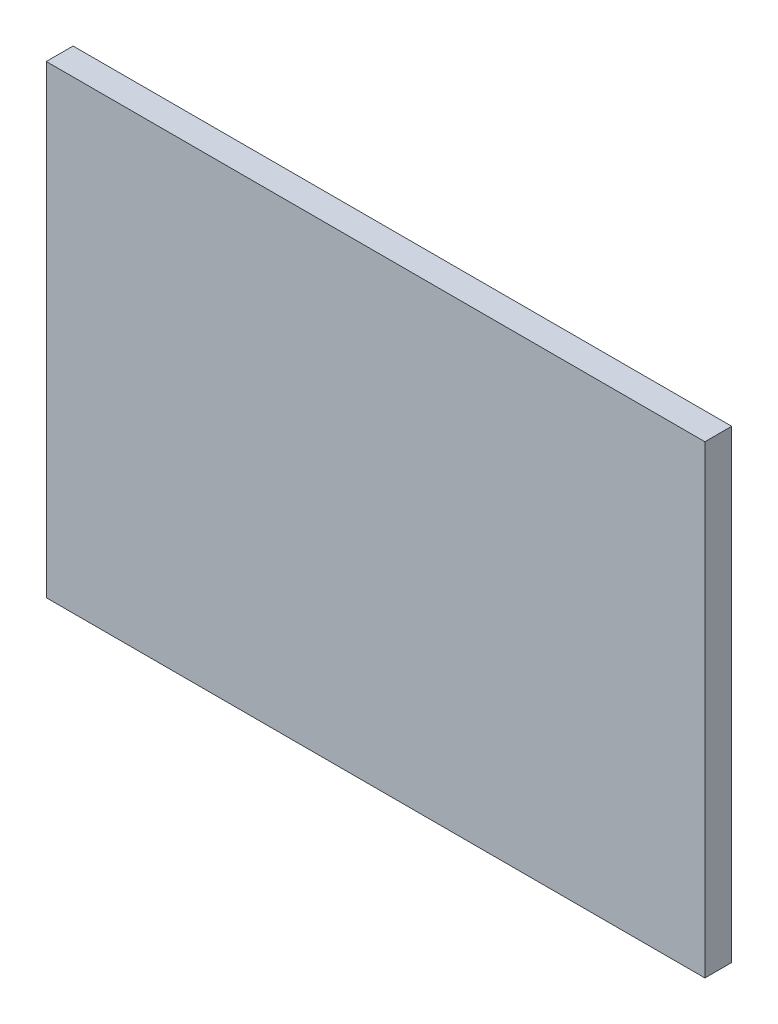
ISO-10303-21;
HEADER;
FILE_DESCRIPTION(('STEP AP214'),'2;1');
FILE_NAME('part.step','',(''),(''),'','','');
FILE_SCHEMA(('AUTOMOTIVE_DESIGN { 1 0 10303 214 1 1 1 1 }'));
ENDSEC;
DATA;
#1=APPLICATION_CONTEXT('core data for automotive mechanical design processes');
#2=APPLICATION_PROTOCOL_DEFINITION('international standard','automotive_design',2000,#1);
#3=PRODUCT_CONTEXT('',#1,'mechanical');
#4=PRODUCT('Part','Part','',(#3));
#5=PRODUCT_RELATED_PRODUCT_CATEGORY('part','',(#4));
#6=PRODUCT_DEFINITION_FORMATION('','',#4);
#7=PRODUCT_DEFINITION_CONTEXT('part definition',#1,'design');
#8=PRODUCT_DEFINITION('design','',#6,#7);
#9=PRODUCT_DEFINITION_SHAPE('','',#8);
#10=(LENGTH_UNIT() NAMED_UNIT(*) SI_UNIT(.MILLI.,.METRE.));
#11=(NAMED_UNIT(*) PLANE_ANGLE_UNIT() SI_UNIT($,.RADIAN.));
#12=(NAMED_UNIT(*) SI_UNIT($,.STERADIAN.) SOLID_ANGLE_UNIT());
#13=UNCERTAINTY_MEASURE_WITH_UNIT(LENGTH_MEASURE(1.E-05),#10,'distance_accuracy_value','');
#14=(GEOMETRIC_REPRESENTATION_CONTEXT(3) GLOBAL_UNCERTAINTY_ASSIGNED_CONTEXT((#13)) GLOBAL_UNIT_ASSIGNED_CONTEXT((#10,
#11,#12)) REPRESENTATION_CONTEXT('',''));
#15=CARTESIAN_POINT('',(0.,0.,0.));
#16=DIRECTION('',(0.,0.,1.));
#17=DIRECTION('',(1.,0.,0.));
#18=AXIS2_PLACEMENT_3D('',#15,#16,#17);
#19=CARTESIAN_POINT('',(19.5,-13.75,1.5875));
#20=DIRECTION('',(-1.,0.,0.));
#21=DIRECTION('',(0.,0.,1.));
#22=AXIS2_PLACEMENT_3D('',#19,#20,#21);
#23=PLANE('',#22);
#24=DIRECTION('',(0.,1.,0.));
#25=VECTOR('',#24,1.);
#26=CARTESIAN_POINT('',(19.5,-13.75,0.));
#27=LINE('',#26,#25);
#28=CARTESIAN_POINT('',(19.5,-13.75,0.));
#29=VERTEX_POINT('',#28);
#30=CARTESIAN_POINT('',(19.5,13.75,0.));
#31=VERTEX_POINT('',#30);
#32=EDGE_CURVE('E97',#29,#31,#27,.T.);
#33=ORIENTED_EDGE('',*,*,#32,.T.);
#34=DIRECTION('',(0.,0.,-1.));
#35=VECTOR('',#34,1.);
#36=CARTESIAN_POINT('',(19.5,13.75,1.5875));
#37=LINE('',#36,#35);
#38=CARTESIAN_POINT('',(19.5,13.75,1.5875));
#39=VERTEX_POINT('',#38);
#40=EDGE_CURVE('E11',#39,#31,#37,.T.);
#41=ORIENTED_EDGE('',*,*,#40,.F.);
#42=DIRECTION('',(0.,1.,0.));
#43=VECTOR('',#42,1.);
#44=CARTESIAN_POINT('',(19.5,-13.75,1.5875));
#45=LINE('',#44,#43);
#46=CARTESIAN_POINT('',(19.5,-13.75,1.5875));
#47=VERTEX_POINT('',#46);
#48=EDGE_CURVE('E85',#47,#39,#45,.T.);
#49=ORIENTED_EDGE('',*,*,#48,.F.);
#50=DIRECTION('',(0.,0.,-1.));
#51=VECTOR('',#50,1.);
#52=CARTESIAN_POINT('',(19.5,-13.75,1.5875));
#53=LINE('',#52,#51);
#54=EDGE_CURVE('E93',#47,#29,#53,.T.);
#55=ORIENTED_EDGE('',*,*,#54,.T.);
#56=EDGE_LOOP('',(#33,#41,#49,#55));
#57=FACE_BOUND('',#56,.T.);
#58=ADVANCED_FACE('F34',(#57),#23,.F.);
#59=CARTESIAN_POINT('',(-19.5,13.75,1.5875));
#60=DIRECTION('',(0.,-1.,0.));
#61=DIRECTION('',(1.,0.,0.));
#62=AXIS2_PLACEMENT_3D('',#59,#60,#61);
#63=PLANE('',#62);
#64=DIRECTION('',(-1.,0.,0.));
#65=VECTOR('',#64,1.);
#66=CARTESIAN_POINT('',(-19.5,13.75,0.));
#67=LINE('',#66,#65);
#68=CARTESIAN_POINT('',(-19.5,13.75,0.));
#69=VERTEX_POINT('',#68);
#70=EDGE_CURVE('E89',#31,#69,#67,.T.);
#71=ORIENTED_EDGE('',*,*,#70,.T.);
#72=DIRECTION('',(0.,0.,-1.));
#73=VECTOR('',#72,1.);
#74=CARTESIAN_POINT('',(-19.5,13.75,1.5875));
#75=LINE('',#74,#73);
#76=CARTESIAN_POINT('',(-19.5,13.75,1.5875));
#77=VERTEX_POINT('',#76);
#78=EDGE_CURVE('E42',#77,#69,#75,.T.);
#79=ORIENTED_EDGE('',*,*,#78,.F.);
#80=DIRECTION('',(-1.,0.,0.));
#81=VECTOR('',#80,1.);
#82=CARTESIAN_POINT('',(-19.5,13.75,1.5875));
#83=LINE('',#82,#81);
#84=EDGE_CURVE('E80',#39,#77,#83,.T.);
#85=ORIENTED_EDGE('',*,*,#84,.F.);
#86=ORIENTED_EDGE('',*,*,#40,.T.);
#87=EDGE_LOOP('',(#71,#79,#85,#86));
#88=FACE_BOUND('',#87,.T.);
#89=ADVANCED_FACE('F88',(#88),#63,.F.);
#90=CARTESIAN_POINT('',(-19.5,-13.75,1.5875));
#91=DIRECTION('',(1.,0.,0.));
#92=DIRECTION('',(0.,1.,0.));
#93=AXIS2_PLACEMENT_3D('',#90,#91,#92);
#94=PLANE('',#93);
#95=DIRECTION('',(0.,-1.,0.));
#96=VECTOR('',#95,1.);
#97=CARTESIAN_POINT('',(-19.5,-13.75,0.));
#98=LINE('',#97,#96);
#99=CARTESIAN_POINT('',(-19.5,-13.75,0.));
#100=VERTEX_POINT('',#99);
#101=EDGE_CURVE('E67',#69,#100,#98,.T.);
#102=ORIENTED_EDGE('',*,*,#101,.T.);
#103=DIRECTION('',(0.,0.,-1.));
#104=VECTOR('',#103,1.);
#105=CARTESIAN_POINT('',(-19.5,-13.75,1.5875));
#106=LINE('',#105,#104);
#107=CARTESIAN_POINT('',(-19.5,-13.75,1.5875));
#108=VERTEX_POINT('',#107);
#109=EDGE_CURVE('E90',#108,#100,#106,.T.);
#110=ORIENTED_EDGE('',*,*,#109,.F.);
#111=DIRECTION('',(0.,-1.,0.));
#112=VECTOR('',#111,1.);
#113=CARTESIAN_POINT('',(-19.5,-13.75,1.5875));
#114=LINE('',#113,#112);
#115=EDGE_CURVE('E83',#77,#108,#114,.T.);
#116=ORIENTED_EDGE('',*,*,#115,.F.);
#117=ORIENTED_EDGE('',*,*,#78,.T.);
#118=EDGE_LOOP('',(#102,#110,#116,#117));
#119=FACE_BOUND('',#118,.T.);
#120=ADVANCED_FACE('F91',(#119),#94,.F.);
#121=CARTESIAN_POINT('',(-19.5,-13.75,1.5875));
#122=DIRECTION('',(0.,1.,0.));
#123=DIRECTION('',(-1.,0.,0.));
#124=AXIS2_PLACEMENT_3D('',#121,#122,#123);
#125=PLANE('',#124);
#126=DIRECTION('',(1.,0.,0.));
#127=VECTOR('',#126,1.);
#128=CARTESIAN_POINT('',(-19.5,-13.75,0.));
#129=LINE('',#128,#127);
#130=EDGE_CURVE('E73',#100,#29,#129,.T.);
#131=ORIENTED_EDGE('',*,*,#130,.T.);
#132=ORIENTED_EDGE('',*,*,#54,.F.);
#133=DIRECTION('',(1.,0.,0.));
#134=VECTOR('',#133,1.);
#135=CARTESIAN_POINT('',(-19.5,-13.75,1.5875));
#136=LINE('',#135,#134);
#137=EDGE_CURVE('E50',#108,#47,#136,.T.);
#138=ORIENTED_EDGE('',*,*,#137,.F.);
#139=ORIENTED_EDGE('',*,*,#109,.T.);
#140=EDGE_LOOP('',(#131,#132,#138,#139));
#141=FACE_BOUND('',#140,.T.);
#142=ADVANCED_FACE('F104',(#141),#125,.F.);
#143=CARTESIAN_POINT('',(0.,0.,1.5875));
#144=DIRECTION('',(0.,0.,-1.));
#145=DIRECTION('',(-1.,0.,0.));
#146=AXIS2_PLACEMENT_3D('',#143,#144,#145);
#147=PLANE('',#146);
#148=ORIENTED_EDGE('',*,*,#48,.T.);
#149=ORIENTED_EDGE('',*,*,#84,.T.);
#150=ORIENTED_EDGE('',*,*,#115,.T.);
#151=ORIENTED_EDGE('',*,*,#137,.T.);
#152=EDGE_LOOP('',(#148,#149,#150,#151));
#153=FACE_BOUND('',#152,.T.);
#154=ADVANCED_FACE('F81',(#153),#147,.F.);
#155=CARTESIAN_POINT('',(0.,0.,0.));
#156=DIRECTION('',(0.,0.,-1.));
#157=DIRECTION('',(-1.,0.,0.));
#158=AXIS2_PLACEMENT_3D('',#155,#156,#157);
#159=PLANE('',#158);
#160=ORIENTED_EDGE('',*,*,#32,.F.);
#161=ORIENTED_EDGE('',*,*,#130,.F.);
#162=ORIENTED_EDGE('',*,*,#101,.F.);
#163=ORIENTED_EDGE('',*,*,#70,.F.);
#164=EDGE_LOOP('',(#160,#161,#162,#163));
#165=FACE_BOUND('',#164,.T.);
#166=ADVANCED_FACE('F107',(#165),#159,.T.);
#167=CLOSED_SHELL('',(#58,#89,#120,#142,#154,#166));
#168=MANIFOLD_SOLID_BREP('B2',#167);
#169=ADVANCED_BREP_SHAPE_REPRESENTATION('',(#18,#168),#14);
#170=SHAPE_DEFINITION_REPRESENTATION(#9,#169);
ENDSEC;
END-ISO-10303-21;
